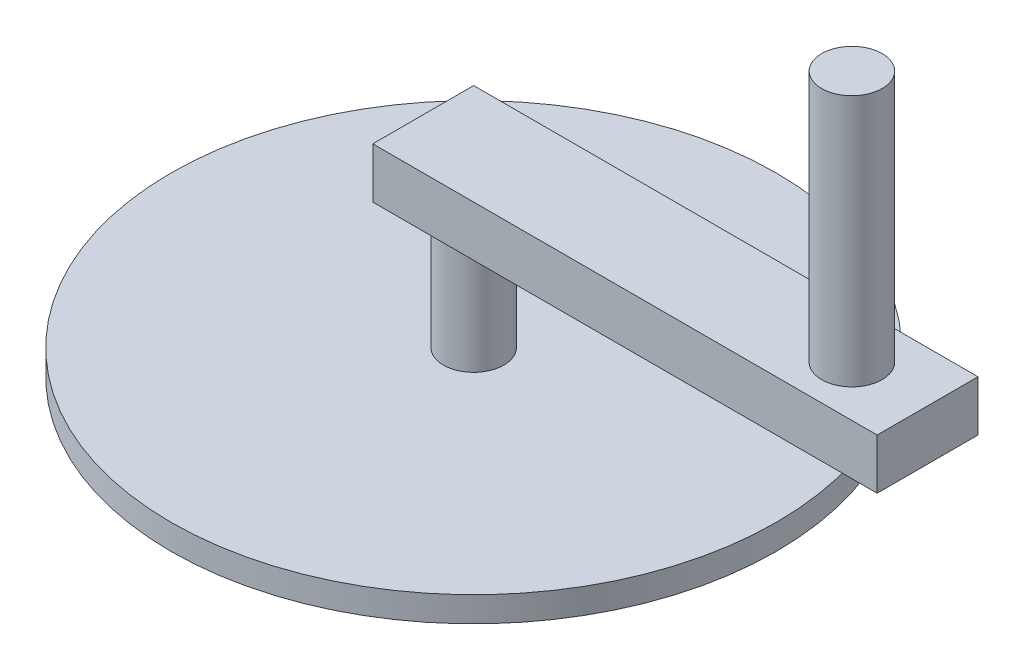
ISO-10303-21;
HEADER;
FILE_DESCRIPTION(('STEP AP214'),'2;1');
FILE_NAME('part.step','',(''),(''),'','','');
FILE_SCHEMA(('AUTOMOTIVE_DESIGN { 1 0 10303 214 1 1 1 1 }'));
ENDSEC;
DATA;
#1=APPLICATION_CONTEXT('core data for automotive mechanical design processes');
#2=APPLICATION_PROTOCOL_DEFINITION('international standard','automotive_design',2000,#1);
#3=PRODUCT_CONTEXT('',#1,'mechanical');
#4=PRODUCT('Part','Part','',(#3));
#5=PRODUCT_RELATED_PRODUCT_CATEGORY('part','',(#4));
#6=PRODUCT_DEFINITION_FORMATION('','',#4);
#7=PRODUCT_DEFINITION_CONTEXT('part definition',#1,'design');
#8=PRODUCT_DEFINITION('design','',#6,#7);
#9=PRODUCT_DEFINITION_SHAPE('','',#8);
#10=(LENGTH_UNIT() NAMED_UNIT(*) SI_UNIT(.MILLI.,.METRE.));
#11=(NAMED_UNIT(*) PLANE_ANGLE_UNIT() SI_UNIT($,.RADIAN.));
#12=(NAMED_UNIT(*) SI_UNIT($,.STERADIAN.) SOLID_ANGLE_UNIT());
#13=UNCERTAINTY_MEASURE_WITH_UNIT(LENGTH_MEASURE(1.E-05),#10,'distance_accuracy_value','');
#14=(GEOMETRIC_REPRESENTATION_CONTEXT(3) GLOBAL_UNCERTAINTY_ASSIGNED_CONTEXT((#13)) GLOBAL_UNIT_ASSIGNED_CONTEXT((#10,
#11,#12)) REPRESENTATION_CONTEXT('',''));
#15=CARTESIAN_POINT('',(0.,0.,0.));
#16=DIRECTION('',(0.,0.,1.));
#17=DIRECTION('',(1.,0.,0.));
#18=AXIS2_PLACEMENT_3D('',#15,#16,#17);
#19=CARTESIAN_POINT('',(-100.,10.,-20.));
#20=DIRECTION('',(1.,0.,0.));
#21=DIRECTION('',(0.,0.,-1.));
#22=AXIS2_PLACEMENT_3D('',#19,#20,#21);
#23=PLANE('',#22);
#24=DIRECTION('',(0.,0.,1.));
#25=VECTOR('',#24,1.);
#26=CARTESIAN_POINT('',(-100.,0.,-20.));
#27=LINE('',#26,#25);
#28=CARTESIAN_POINT('',(-100.,0.,-20.));
#29=VERTEX_POINT('',#28);
#30=CARTESIAN_POINT('',(-100.,0.,0.));
#31=VERTEX_POINT('',#30);
#32=EDGE_CURVE('E100',#29,#31,#27,.T.);
#33=ORIENTED_EDGE('',*,*,#32,.T.);
#34=DIRECTION('',(0.,-1.,0.));
#35=VECTOR('',#34,1.);
#36=CARTESIAN_POINT('',(-100.,10.,0.));
#37=LINE('',#36,#35);
#38=CARTESIAN_POINT('',(-100.,10.,0.));
#39=VERTEX_POINT('',#38);
#40=EDGE_CURVE('E42',#39,#31,#37,.T.);
#41=ORIENTED_EDGE('',*,*,#40,.F.);
#42=DIRECTION('',(0.,0.,1.));
#43=VECTOR('',#42,1.);
#44=CARTESIAN_POINT('',(-100.,10.,-20.));
#45=LINE('',#44,#43);
#46=CARTESIAN_POINT('',(-100.,10.,-20.));
#47=VERTEX_POINT('',#46);
#48=EDGE_CURVE('E86',#47,#39,#45,.T.);
#49=ORIENTED_EDGE('',*,*,#48,.F.);
#50=DIRECTION('',(0.,-1.,0.));
#51=VECTOR('',#50,1.);
#52=CARTESIAN_POINT('',(-100.,10.,-20.));
#53=LINE('',#52,#51);
#54=EDGE_CURVE('E96',#47,#29,#53,.T.);
#55=ORIENTED_EDGE('',*,*,#54,.T.);
#56=EDGE_LOOP('',(#33,#41,#49,#55));
#57=FACE_BOUND('',#56,.T.);
#58=ADVANCED_FACE('F33',(#57),#23,.F.);
#59=CARTESIAN_POINT('',(-100.,10.,0.));
#60=DIRECTION('',(0.,0.,-1.));
#61=DIRECTION('',(-1.,0.,0.));
#62=AXIS2_PLACEMENT_3D('',#59,#60,#61);
#63=PLANE('',#62);
#64=DIRECTION('',(1.,0.,0.));
#65=VECTOR('',#64,1.);
#66=CARTESIAN_POINT('',(-100.,0.,0.));
#67=LINE('',#66,#65);
#68=CARTESIAN_POINT('',(0.,0.,0.));
#69=VERTEX_POINT('',#68);
#70=EDGE_CURVE('E91',#31,#69,#67,.T.);
#71=ORIENTED_EDGE('',*,*,#70,.T.);
#72=DIRECTION('',(0.,-1.,0.));
#73=VECTOR('',#72,1.);
#74=CARTESIAN_POINT('',(0.,10.,0.));
#75=LINE('',#74,#73);
#76=CARTESIAN_POINT('',(0.,10.,0.));
#77=VERTEX_POINT('',#76);
#78=EDGE_CURVE('E89',#77,#69,#75,.T.);
#79=ORIENTED_EDGE('',*,*,#78,.F.);
#80=DIRECTION('',(1.,0.,0.));
#81=VECTOR('',#80,1.);
#82=CARTESIAN_POINT('',(-100.,10.,0.));
#83=LINE('',#82,#81);
#84=EDGE_CURVE('E81',#39,#77,#83,.T.);
#85=ORIENTED_EDGE('',*,*,#84,.F.);
#86=ORIENTED_EDGE('',*,*,#40,.T.);
#87=EDGE_LOOP('',(#71,#79,#85,#86));
#88=FACE_BOUND('',#87,.T.);
#89=ADVANCED_FACE('F90',(#88),#63,.F.);
#90=CARTESIAN_POINT('',(0.,10.,-20.));
#91=DIRECTION('',(-1.,0.,0.));
#92=DIRECTION('',(0.,0.,1.));
#93=AXIS2_PLACEMENT_3D('',#90,#91,#92);
#94=PLANE('',#93);
#95=DIRECTION('',(0.,0.,-1.));
#96=VECTOR('',#95,1.);
#97=CARTESIAN_POINT('',(0.,0.,-20.));
#98=LINE('',#97,#96);
#99=CARTESIAN_POINT('',(0.,0.,-20.));
#100=VERTEX_POINT('',#99);
#101=EDGE_CURVE('E67',#69,#100,#98,.T.);
#102=ORIENTED_EDGE('',*,*,#101,.T.);
#103=DIRECTION('',(0.,-1.,0.));
#104=VECTOR('',#103,1.);
#105=CARTESIAN_POINT('',(0.,10.,-20.));
#106=LINE('',#105,#104);
#107=CARTESIAN_POINT('',(0.,10.,-20.));
#108=VERTEX_POINT('',#107);
#109=EDGE_CURVE('E92',#108,#100,#106,.T.);
#110=ORIENTED_EDGE('',*,*,#109,.F.);
#111=DIRECTION('',(0.,0.,-1.));
#112=VECTOR('',#111,1.);
#113=CARTESIAN_POINT('',(0.,10.,-20.));
#114=LINE('',#113,#112);
#115=EDGE_CURVE('E84',#77,#108,#114,.T.);
#116=ORIENTED_EDGE('',*,*,#115,.F.);
#117=ORIENTED_EDGE('',*,*,#78,.T.);
#118=EDGE_LOOP('',(#102,#110,#116,#117));
#119=FACE_BOUND('',#118,.T.);
#120=ADVANCED_FACE('F94',(#119),#94,.F.);
#121=CARTESIAN_POINT('',(-100.,10.,-20.));
#122=DIRECTION('',(0.,0.,1.));
#123=DIRECTION('',(1.,0.,0.));
#124=AXIS2_PLACEMENT_3D('',#121,#122,#123);
#125=PLANE('',#124);
#126=DIRECTION('',(-1.,0.,0.));
#127=VECTOR('',#126,1.);
#128=CARTESIAN_POINT('',(-100.,0.,-20.));
#129=LINE('',#128,#127);
#130=EDGE_CURVE('E73',#100,#29,#129,.T.);
#131=ORIENTED_EDGE('',*,*,#130,.T.);
#132=ORIENTED_EDGE('',*,*,#54,.F.);
#133=DIRECTION('',(-1.,0.,0.));
#134=VECTOR('',#133,1.);
#135=CARTESIAN_POINT('',(-100.,10.,-20.));
#136=LINE('',#135,#134);
#137=EDGE_CURVE('E50',#108,#47,#136,.T.);
#138=ORIENTED_EDGE('',*,*,#137,.F.);
#139=ORIENTED_EDGE('',*,*,#109,.T.);
#140=EDGE_LOOP('',(#131,#132,#138,#139));
#141=FACE_BOUND('',#140,.T.);
#142=ADVANCED_FACE('F126',(#141),#125,.F.);
#143=CARTESIAN_POINT('',(0.,10.,0.));
#144=DIRECTION('',(0.,1.,0.));
#145=DIRECTION('',(0.,0.,1.));
#146=AXIS2_PLACEMENT_3D('',#143,#144,#145);
#147=PLANE('',#146);
#148=CARTESIAN_POINT('',(-15.,10.,-10.));
#149=DIRECTION('',(0.,1.,0.));
#150=DIRECTION('',(0.,0.,1.));
#151=AXIS2_PLACEMENT_3D('',#148,#149,#150);
#152=CIRCLE('',#151,6.);
#153=CARTESIAN_POINT('',(-15.,10.,-4.));
#154=VERTEX_POINT('',#153);
#155=EDGE_CURVE('E239',#154,#154,#152,.T.);
#156=ORIENTED_EDGE('',*,*,#155,.F.);
#157=EDGE_LOOP('',(#156));
#158=FACE_BOUND('',#157,.T.);
#159=ORIENTED_EDGE('',*,*,#48,.T.);
#160=ORIENTED_EDGE('',*,*,#84,.T.);
#161=ORIENTED_EDGE('',*,*,#115,.T.);
#162=ORIENTED_EDGE('',*,*,#137,.T.);
#163=EDGE_LOOP('',(#159,#160,#161,#162));
#164=FACE_BOUND('',#163,.T.);
#165=ADVANCED_FACE('F82',(#158,#164),#147,.T.);
#166=CARTESIAN_POINT('',(0.,0.,0.));
#167=DIRECTION('',(0.,1.,0.));
#168=DIRECTION('',(0.,0.,1.));
#169=AXIS2_PLACEMENT_3D('',#166,#167,#168);
#170=PLANE('',#169);
#171=CARTESIAN_POINT('',(-90.,0.,-10.));
#172=DIRECTION('',(0.,1.,0.));
#173=DIRECTION('',(0.,0.,1.));
#174=AXIS2_PLACEMENT_3D('',#171,#172,#173);
#175=CIRCLE('',#174,6.);
#176=CARTESIAN_POINT('',(-90.,0.,-4.));
#177=VERTEX_POINT('',#176);
#178=EDGE_CURVE('E11',#177,#177,#175,.F.);
#179=ORIENTED_EDGE('',*,*,#178,.F.);
#180=EDGE_LOOP('',(#179));
#181=FACE_BOUND('',#180,.T.);
#182=ORIENTED_EDGE('',*,*,#32,.F.);
#183=ORIENTED_EDGE('',*,*,#130,.F.);
#184=ORIENTED_EDGE('',*,*,#101,.F.);
#185=ORIENTED_EDGE('',*,*,#70,.F.);
#186=EDGE_LOOP('',(#182,#183,#184,#185));
#187=FACE_BOUND('',#186,.T.);
#188=ADVANCED_FACE('F112',(#181,#187),#170,.F.);
#189=CARTESIAN_POINT('',(-15.,60.,-10.));
#190=DIRECTION('',(0.,-1.,0.));
#191=DIRECTION('',(0.,0.,-1.));
#192=AXIS2_PLACEMENT_3D('',#189,#190,#191);
#193=CYLINDRICAL_SURFACE('',#192,6.);
#194=CARTESIAN_POINT('',(-15.,60.,-10.));
#195=DIRECTION('',(0.,1.,0.));
#196=DIRECTION('',(0.,0.,1.));
#197=AXIS2_PLACEMENT_3D('',#194,#195,#196);
#198=CIRCLE('',#197,6.);
#199=CARTESIAN_POINT('',(-15.,60.,-4.));
#200=VERTEX_POINT('',#199);
#201=EDGE_CURVE('E103',#200,#200,#198,.T.);
#202=ORIENTED_EDGE('',*,*,#201,.F.);
#203=EDGE_LOOP('',(#202));
#204=FACE_BOUND('',#203,.T.);
#205=ORIENTED_EDGE('',*,*,#155,.T.);
#206=EDGE_LOOP('',(#205));
#207=FACE_BOUND('',#206,.T.);
#208=ADVANCED_FACE('F114',(#204,#207),#193,.T.);
#209=CARTESIAN_POINT('',(-15.,60.,-10.));
#210=DIRECTION('',(0.,1.,0.));
#211=DIRECTION('',(0.,0.,1.));
#212=AXIS2_PLACEMENT_3D('',#209,#210,#211);
#213=PLANE('',#212);
#214=ORIENTED_EDGE('',*,*,#201,.T.);
#215=EDGE_LOOP('',(#214));
#216=FACE_BOUND('',#215,.T.);
#217=ADVANCED_FACE('F122',(#216),#213,.T.);
#218=CARTESIAN_POINT('',(-90.,-30.,-10.));
#219=DIRECTION('',(0.,1.,0.));
#220=DIRECTION('',(0.,0.,1.));
#221=AXIS2_PLACEMENT_3D('',#218,#219,#220);
#222=CYLINDRICAL_SURFACE('',#221,6.);
#223=CARTESIAN_POINT('',(-90.,-25.,-10.));
#224=DIRECTION('',(0.,1.,0.));
#225=DIRECTION('',(0.,0.,1.));
#226=AXIS2_PLACEMENT_3D('',#223,#224,#225);
#227=CIRCLE('',#226,6.);
#228=CARTESIAN_POINT('',(-90.,-25.,-4.));
#229=VERTEX_POINT('',#228);
#230=EDGE_CURVE('E36',#229,#229,#227,.T.);
#231=ORIENTED_EDGE('',*,*,#230,.T.);
#232=EDGE_LOOP('',(#231));
#233=FACE_BOUND('',#232,.T.);
#234=ORIENTED_EDGE('',*,*,#178,.T.);
#235=EDGE_LOOP('',(#234));
#236=FACE_BOUND('',#235,.T.);
#237=ADVANCED_FACE('F161',(#233,#236),#222,.T.);
#238=CARTESIAN_POINT('',(-90.,-25.,-10.));
#239=DIRECTION('',(0.,-1.,0.));
#240=DIRECTION('',(0.,0.,-1.));
#241=AXIS2_PLACEMENT_3D('',#238,#239,#240);
#242=CYLINDRICAL_SURFACE('',#241,60.);
#243=CARTESIAN_POINT('',(-90.,-25.,-10.));
#244=DIRECTION('',(0.,1.,0.));
#245=DIRECTION('',(0.,0.,1.));
#246=AXIS2_PLACEMENT_3D('',#243,#244,#245);
#247=CIRCLE('',#246,60.);
#248=CARTESIAN_POINT('',(-90.,-25.,50.));
#249=VERTEX_POINT('',#248);
#250=EDGE_CURVE('E230',#249,#249,#247,.T.);
#251=ORIENTED_EDGE('',*,*,#250,.F.);
#252=EDGE_LOOP('',(#251));
#253=FACE_BOUND('',#252,.T.);
#254=CARTESIAN_POINT('',(-90.,-30.,-10.));
#255=DIRECTION('',(0.,1.,0.));
#256=DIRECTION('',(0.,0.,1.));
#257=AXIS2_PLACEMENT_3D('',#254,#255,#256);
#258=CIRCLE('',#257,60.);
#259=CARTESIAN_POINT('',(-90.,-30.,50.));
#260=VERTEX_POINT('',#259);
#261=EDGE_CURVE('E234',#260,#260,#258,.T.);
#262=ORIENTED_EDGE('',*,*,#261,.T.);
#263=EDGE_LOOP('',(#262));
#264=FACE_BOUND('',#263,.T.);
#265=ADVANCED_FACE('F170',(#253,#264),#242,.T.);
#266=CARTESIAN_POINT('',(-90.,-25.,-10.));
#267=DIRECTION('',(0.,1.,0.));
#268=DIRECTION('',(0.,0.,1.));
#269=AXIS2_PLACEMENT_3D('',#266,#267,#268);
#270=PLANE('',#269);
#271=ORIENTED_EDGE('',*,*,#230,.F.);
#272=EDGE_LOOP('',(#271));
#273=FACE_BOUND('',#272,.T.);
#274=ORIENTED_EDGE('',*,*,#250,.T.);
#275=EDGE_LOOP('',(#274));
#276=FACE_BOUND('',#275,.T.);
#277=ADVANCED_FACE('F181',(#273,#276),#270,.T.);
#278=CARTESIAN_POINT('',(-90.,-30.,-10.));
#279=DIRECTION('',(0.,1.,0.));
#280=DIRECTION('',(0.,0.,1.));
#281=AXIS2_PLACEMENT_3D('',#278,#279,#280);
#282=PLANE('',#281);
#283=CARTESIAN_POINT('',(-90.,-30.,-10.));
#284=DIRECTION('',(0.,1.,0.));
#285=DIRECTION('',(0.,0.,1.));
#286=AXIS2_PLACEMENT_3D('',#283,#284,#285);
#287=CIRCLE('',#286,30.);
#288=CARTESIAN_POINT('',(-90.,-30.,20.));
#289=VERTEX_POINT('',#288);
#290=EDGE_CURVE('E229',#289,#289,#287,.T.);
#291=ORIENTED_EDGE('',*,*,#290,.T.);
#292=EDGE_LOOP('',(#291));
#293=FACE_BOUND('',#292,.T.);
#294=ORIENTED_EDGE('',*,*,#261,.F.);
#295=EDGE_LOOP('',(#294));
#296=FACE_BOUND('',#295,.T.);
#297=ADVANCED_FACE('F189',(#293,#296),#282,.F.);
#298=CARTESIAN_POINT('',(-90.,-35.,-10.));
#299=DIRECTION('',(0.,-1.,0.));
#300=DIRECTION('',(0.,0.,-1.));
#301=AXIS2_PLACEMENT_3D('',#298,#299,#300);
#302=PLANE('',#301);
#303=CARTESIAN_POINT('',(-90.,-35.,-10.));
#304=DIRECTION('',(0.,-1.,0.));
#305=DIRECTION('',(0.,0.,-1.));
#306=AXIS2_PLACEMENT_3D('',#303,#304,#305);
#307=CIRCLE('',#306,30.);
#308=CARTESIAN_POINT('',(-90.,-35.,-40.));
#309=VERTEX_POINT('',#308);
#310=EDGE_CURVE('E226',#309,#309,#307,.T.);
#311=ORIENTED_EDGE('',*,*,#310,.T.);
#312=EDGE_LOOP('',(#311));
#313=FACE_BOUND('',#312,.T.);
#314=ADVANCED_FACE('F197',(#313),#302,.T.);
#315=CARTESIAN_POINT('',(-90.,-35.,-10.));
#316=DIRECTION('',(0.,1.,0.));
#317=DIRECTION('',(0.,0.,1.));
#318=AXIS2_PLACEMENT_3D('',#315,#316,#317);
#319=CYLINDRICAL_SURFACE('',#318,30.);
#320=ORIENTED_EDGE('',*,*,#310,.F.);
#321=EDGE_LOOP('',(#320));
#322=FACE_BOUND('',#321,.T.);
#323=ORIENTED_EDGE('',*,*,#290,.F.);
#324=EDGE_LOOP('',(#323));
#325=FACE_BOUND('',#324,.T.);
#326=ADVANCED_FACE('F204',(#322,#325),#319,.T.);
#327=CLOSED_SHELL('',(#58,#89,#120,#142,#165,#188,#208,#217,#237,#265,#277,#297,#314,#326));
#328=MANIFOLD_SOLID_BREP('B2',#327);
#329=ADVANCED_BREP_SHAPE_REPRESENTATION('',(#18,#328),#14);
#330=SHAPE_DEFINITION_REPRESENTATION(#9,#329);
ENDSEC;
END-ISO-10303-21;
